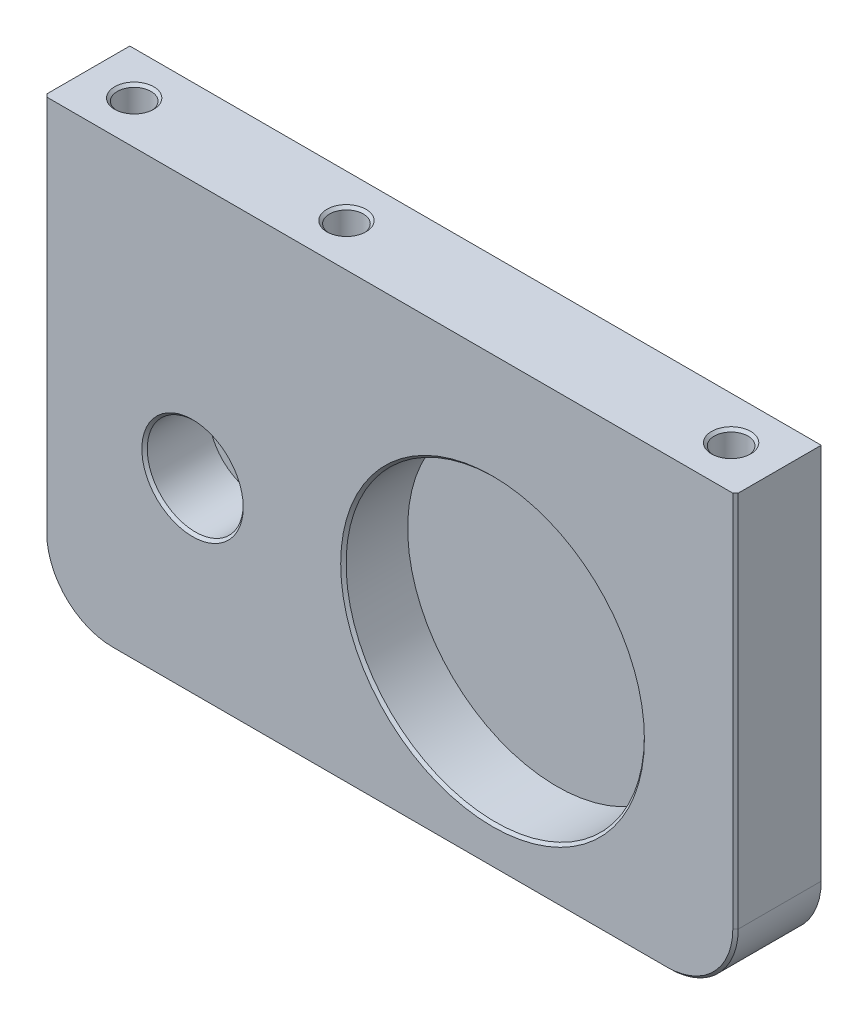
ISO-10303-21;
HEADER;
FILE_DESCRIPTION(('STEP AP214'),'2;1');
FILE_NAME('part.step','',(''),(''),'','','');
FILE_SCHEMA(('AUTOMOTIVE_DESIGN { 1 0 10303 214 1 1 1 1 }'));
ENDSEC;
DATA;
#1=APPLICATION_CONTEXT('core data for automotive mechanical design processes');
#2=APPLICATION_PROTOCOL_DEFINITION('international standard','automotive_design',2000,#1);
#3=PRODUCT_CONTEXT('',#1,'mechanical');
#4=PRODUCT('Part','Part','',(#3));
#5=PRODUCT_RELATED_PRODUCT_CATEGORY('part','',(#4));
#6=PRODUCT_DEFINITION_FORMATION('','',#4);
#7=PRODUCT_DEFINITION_CONTEXT('part definition',#1,'design');
#8=PRODUCT_DEFINITION('design','',#6,#7);
#9=PRODUCT_DEFINITION_SHAPE('','',#8);
#10=(LENGTH_UNIT() NAMED_UNIT(*) SI_UNIT(.MILLI.,.METRE.));
#11=(NAMED_UNIT(*) PLANE_ANGLE_UNIT() SI_UNIT($,.RADIAN.));
#12=(NAMED_UNIT(*) SI_UNIT($,.STERADIAN.) SOLID_ANGLE_UNIT());
#13=UNCERTAINTY_MEASURE_WITH_UNIT(LENGTH_MEASURE(1.E-05),#10,'distance_accuracy_value','');
#14=(GEOMETRIC_REPRESENTATION_CONTEXT(3) GLOBAL_UNCERTAINTY_ASSIGNED_CONTEXT((#13)) GLOBAL_UNIT_ASSIGNED_CONTEXT((#10,
#11,#12)) REPRESENTATION_CONTEXT('',''));
#15=CARTESIAN_POINT('',(0.,0.,0.));
#16=DIRECTION('',(0.,0.,1.));
#17=DIRECTION('',(1.,0.,0.));
#18=AXIS2_PLACEMENT_3D('',#15,#16,#17);
#19=CARTESIAN_POINT('',(-33.225,19.05,145.761703917476));
#20=DIRECTION('',(-1.,0.,0.));
#21=DIRECTION('',(0.,-1.,0.));
#22=AXIS2_PLACEMENT_3D('',#19,#20,#21);
#23=PLANE('',#22);
#24=DIRECTION('',(0.,0.,1.));
#25=VECTOR('',#24,1.);
#26=CARTESIAN_POINT('',(-33.225,-8.92,145.761703917476));
#27=LINE('',#26,#25);
#28=CARTESIAN_POINT('',(-33.225,-8.92,145.761703917476));
#29=VERTEX_POINT('',#28);
#30=CARTESIAN_POINT('',(-33.225,-8.92,151.911703917476));
#31=VERTEX_POINT('',#30);
#32=EDGE_CURVE('E152',#29,#31,#27,.T.);
#33=ORIENTED_EDGE('',*,*,#32,.T.);
#34=DIRECTION('',(0.,1.,0.));
#35=VECTOR('',#34,1.);
#36=CARTESIAN_POINT('',(-33.225,19.05,151.911703917476));
#37=LINE('',#36,#35);
#38=CARTESIAN_POINT('',(-33.225,19.05,151.911703917476));
#39=VERTEX_POINT('',#38);
#40=EDGE_CURVE('E189',#31,#39,#37,.T.);
#41=ORIENTED_EDGE('',*,*,#40,.T.);
#42=DIRECTION('',(0.,0.,1.));
#43=VECTOR('',#42,1.);
#44=CARTESIAN_POINT('',(-33.225,19.05,145.761703917476));
#45=LINE('',#44,#43);
#46=CARTESIAN_POINT('',(-33.225,19.05,145.761703917476));
#47=VERTEX_POINT('',#46);
#48=EDGE_CURVE('E128',#47,#39,#45,.T.);
#49=ORIENTED_EDGE('',*,*,#48,.F.);
#50=DIRECTION('',(0.,-1.,0.));
#51=VECTOR('',#50,1.);
#52=CARTESIAN_POINT('',(-33.225,19.05,145.761703917476));
#53=LINE('',#52,#51);
#54=EDGE_CURVE('E133',#47,#29,#53,.T.);
#55=ORIENTED_EDGE('',*,*,#54,.T.);
#56=EDGE_LOOP('',(#33,#41,#49,#55));
#57=FACE_BOUND('',#56,.T.);
#58=ADVANCED_FACE('F36',(#57),#23,.T.);
#59=CARTESIAN_POINT('',(-33.225,19.05,145.761703917476));
#60=DIRECTION('',(0.,1.,0.));
#61=DIRECTION('',(0.,0.,1.));
#62=AXIS2_PLACEMENT_3D('',#59,#60,#61);
#63=PLANE('',#62);
#64=CARTESIAN_POINT('',(14.5,19.05,148.936703917476));
#65=DIRECTION('',(0.,1.,0.));
#66=DIRECTION('',(0.,0.,1.));
#67=AXIS2_PLACEMENT_3D('',#64,#65,#66);
#68=CIRCLE('',#67,1.45000000000001);
#69=CARTESIAN_POINT('',(14.5,19.05,150.386703917476));
#70=VERTEX_POINT('',#69);
#71=EDGE_CURVE('E179',#70,#70,#68,.F.);
#72=ORIENTED_EDGE('',*,*,#71,.T.);
#73=EDGE_LOOP('',(#72));
#74=FACE_BOUND('',#73,.T.);
#75=CARTESIAN_POINT('',(-29.725,19.05,148.936703917476));
#76=DIRECTION('',(0.,1.,0.));
#77=DIRECTION('',(0.,0.,1.));
#78=AXIS2_PLACEMENT_3D('',#75,#76,#77);
#79=CIRCLE('',#78,1.45000000000001);
#80=CARTESIAN_POINT('',(-29.725,19.05,150.386703917476));
#81=VERTEX_POINT('',#80);
#82=EDGE_CURVE('E176',#81,#81,#79,.F.);
#83=ORIENTED_EDGE('',*,*,#82,.T.);
#84=EDGE_LOOP('',(#83));
#85=FACE_BOUND('',#84,.T.);
#86=CARTESIAN_POINT('',(-14.,19.05,148.936703917476));
#87=DIRECTION('',(0.,1.,0.));
#88=DIRECTION('',(0.,0.,1.));
#89=AXIS2_PLACEMENT_3D('',#86,#87,#88);
#90=CIRCLE('',#89,1.45000000000001);
#91=CARTESIAN_POINT('',(-14.,19.05,150.386703917476));
#92=VERTEX_POINT('',#91);
#93=EDGE_CURVE('E173',#92,#92,#90,.F.);
#94=ORIENTED_EDGE('',*,*,#93,.T.);
#95=EDGE_LOOP('',(#94));
#96=FACE_BOUND('',#95,.T.);
#97=DIRECTION('',(-1.,0.,0.));
#98=VECTOR('',#97,1.);
#99=CARTESIAN_POINT('',(-33.225,19.05,152.111703917476));
#100=LINE('',#99,#98);
#101=CARTESIAN_POINT('',(17.8,19.05,152.111703917476));
#102=VERTEX_POINT('',#101);
#103=CARTESIAN_POINT('',(-33.025,19.05,152.111703917476));
#104=VERTEX_POINT('',#103);
#105=EDGE_CURVE('E137',#102,#104,#100,.T.);
#106=ORIENTED_EDGE('',*,*,#105,.F.);
#107=DIRECTION('',(-0.707106781186561,0.,0.707106781186534));
#108=VECTOR('',#107,1.);
#109=CARTESIAN_POINT('',(-4.53750000000096,19.05,174.449203917476));
#110=LINE('',#109,#108);
#111=CARTESIAN_POINT('',(18.,19.05,151.911703917476));
#112=VERTEX_POINT('',#111);
#113=EDGE_CURVE('E127',#102,#112,#110,.F.);
#114=ORIENTED_EDGE('',*,*,#113,.T.);
#115=DIRECTION('',(0.,0.,1.));
#116=VECTOR('',#115,1.);
#117=CARTESIAN_POINT('',(18.,19.05,145.761703917476));
#118=LINE('',#117,#116);
#119=CARTESIAN_POINT('',(18.,19.05,145.761703917476));
#120=VERTEX_POINT('',#119);
#121=EDGE_CURVE('E113',#120,#112,#118,.T.);
#122=ORIENTED_EDGE('',*,*,#121,.F.);
#123=DIRECTION('',(-1.,0.,0.));
#124=VECTOR('',#123,1.);
#125=CARTESIAN_POINT('',(-33.225,19.05,145.761703917476));
#126=LINE('',#125,#124);
#127=EDGE_CURVE('E118',#120,#47,#126,.T.);
#128=ORIENTED_EDGE('',*,*,#127,.T.);
#129=ORIENTED_EDGE('',*,*,#48,.T.);
#130=DIRECTION('',(-0.707106781186565,0.,-0.70710678118653));
#131=VECTOR('',#130,1.);
#132=CARTESIAN_POINT('',(-36.3,19.05,148.836703917476));
#133=LINE('',#132,#131);
#134=EDGE_CURVE('E182',#39,#104,#133,.F.);
#135=ORIENTED_EDGE('',*,*,#134,.T.);
#136=EDGE_LOOP('',(#106,#114,#122,#128,#129,#135));
#137=FACE_BOUND('',#136,.T.);
#138=ADVANCED_FACE('F124',(#74,#85,#96,#137),#63,.T.);
#139=CARTESIAN_POINT('',(18.,19.05,145.761703917476));
#140=DIRECTION('',(1.,0.,0.));
#141=DIRECTION('',(0.,1.,0.));
#142=AXIS2_PLACEMENT_3D('',#139,#140,#141);
#143=PLANE('',#142);
#144=ORIENTED_EDGE('',*,*,#121,.T.);
#145=DIRECTION('',(0.,-1.,0.));
#146=VECTOR('',#145,1.);
#147=CARTESIAN_POINT('',(18.,19.05,151.911703917476));
#148=LINE('',#147,#146);
#149=CARTESIAN_POINT('',(18.,-8.92,151.911703917476));
#150=VERTEX_POINT('',#149);
#151=EDGE_CURVE('E61',#112,#150,#148,.T.);
#152=ORIENTED_EDGE('',*,*,#151,.T.);
#153=DIRECTION('',(0.,0.,1.));
#154=VECTOR('',#153,1.);
#155=CARTESIAN_POINT('',(18.,-8.92,145.761703917476));
#156=LINE('',#155,#154);
#157=CARTESIAN_POINT('',(18.,-8.92,145.761703917476));
#158=VERTEX_POINT('',#157);
#159=EDGE_CURVE('E114',#150,#158,#156,.F.);
#160=ORIENTED_EDGE('',*,*,#159,.T.);
#161=DIRECTION('',(0.,1.,0.));
#162=VECTOR('',#161,1.);
#163=CARTESIAN_POINT('',(18.,19.05,145.761703917476));
#164=LINE('',#163,#162);
#165=EDGE_CURVE('E110',#158,#120,#164,.T.);
#166=ORIENTED_EDGE('',*,*,#165,.T.);
#167=EDGE_LOOP('',(#144,#152,#160,#166));
#168=FACE_BOUND('',#167,.T.);
#169=ADVANCED_FACE('F112',(#168),#143,.T.);
#170=CARTESIAN_POINT('',(-33.225,-14.,145.761703917476));
#171=DIRECTION('',(0.,-1.,0.));
#172=DIRECTION('',(0.,0.,-1.));
#173=AXIS2_PLACEMENT_3D('',#170,#171,#172);
#174=PLANE('',#173);
#175=DIRECTION('',(0.,0.,1.));
#176=VECTOR('',#175,1.);
#177=CARTESIAN_POINT('',(12.92,-14.,145.761703917476));
#178=LINE('',#177,#176);
#179=CARTESIAN_POINT('',(12.92,-14.,145.761703917476));
#180=VERTEX_POINT('',#179);
#181=CARTESIAN_POINT('',(12.92,-14.,151.911703917476));
#182=VERTEX_POINT('',#181);
#183=EDGE_CURVE('E144',#180,#182,#178,.T.);
#184=ORIENTED_EDGE('',*,*,#183,.T.);
#185=DIRECTION('',(-1.,0.,0.));
#186=VECTOR('',#185,1.);
#187=CARTESIAN_POINT('',(-33.225,-14.,151.911703917476));
#188=LINE('',#187,#186);
#189=CARTESIAN_POINT('',(-28.145,-14.,151.911703917476));
#190=VERTEX_POINT('',#189);
#191=EDGE_CURVE('E171',#182,#190,#188,.T.);
#192=ORIENTED_EDGE('',*,*,#191,.T.);
#193=DIRECTION('',(0.,0.,1.));
#194=VECTOR('',#193,1.);
#195=CARTESIAN_POINT('',(-28.145,-14.,145.761703917476));
#196=LINE('',#195,#194);
#197=CARTESIAN_POINT('',(-28.145,-14.,145.761703917476));
#198=VERTEX_POINT('',#197);
#199=EDGE_CURVE('E141',#190,#198,#196,.F.);
#200=ORIENTED_EDGE('',*,*,#199,.T.);
#201=DIRECTION('',(1.,0.,0.));
#202=VECTOR('',#201,1.);
#203=CARTESIAN_POINT('',(-33.225,-14.,145.761703917476));
#204=LINE('',#203,#202);
#205=EDGE_CURVE('E119',#198,#180,#204,.T.);
#206=ORIENTED_EDGE('',*,*,#205,.T.);
#207=EDGE_LOOP('',(#184,#192,#200,#206));
#208=FACE_BOUND('',#207,.T.);
#209=ADVANCED_FACE('F236',(#208),#174,.T.);
#210=CARTESIAN_POINT('',(0.,0.,145.761703917476));
#211=DIRECTION('',(0.,0.,1.));
#212=DIRECTION('',(1.,0.,0.));
#213=AXIS2_PLACEMENT_3D('',#210,#211,#212);
#214=PLANE('',#213);
#215=ORIENTED_EDGE('',*,*,#165,.F.);
#216=CARTESIAN_POINT('',(12.92,-8.92,145.761703917476));
#217=DIRECTION('',(0.,0.,1.));
#218=DIRECTION('',(1.,0.,0.));
#219=AXIS2_PLACEMENT_3D('',#216,#217,#218);
#220=CIRCLE('',#219,5.08);
#221=EDGE_CURVE('E150',#158,#180,#220,.F.);
#222=ORIENTED_EDGE('',*,*,#221,.T.);
#223=ORIENTED_EDGE('',*,*,#205,.F.);
#224=CARTESIAN_POINT('',(-28.145,-8.92,145.761703917476));
#225=DIRECTION('',(0.,0.,1.));
#226=DIRECTION('',(1.,0.,0.));
#227=AXIS2_PLACEMENT_3D('',#224,#225,#226);
#228=CIRCLE('',#227,5.08);
#229=EDGE_CURVE('E148',#198,#29,#228,.F.);
#230=ORIENTED_EDGE('',*,*,#229,.T.);
#231=ORIENTED_EDGE('',*,*,#54,.F.);
#232=ORIENTED_EDGE('',*,*,#127,.F.);
#233=EDGE_LOOP('',(#215,#222,#223,#230,#231,#232));
#234=FACE_BOUND('',#233,.T.);
#235=ADVANCED_FACE('F131',(#234),#214,.F.);
#236=CARTESIAN_POINT('',(0.,0.,152.111703917476));
#237=DIRECTION('',(0.,0.,1.));
#238=DIRECTION('',(1.,0.,0.));
#239=AXIS2_PLACEMENT_3D('',#236,#237,#238);
#240=PLANE('',#239);
#241=CARTESIAN_POINT('',(0.,0.,152.111703917476));
#242=DIRECTION('',(0.,0.,1.));
#243=DIRECTION('',(1.,0.,0.));
#244=AXIS2_PLACEMENT_3D('',#241,#242,#243);
#245=CIRCLE('',#244,11.25);
#246=CARTESIAN_POINT('',(11.25,0.,152.111703917476));
#247=VERTEX_POINT('',#246);
#248=EDGE_CURVE('E157',#247,#247,#245,.F.);
#249=ORIENTED_EDGE('',*,*,#248,.T.);
#250=EDGE_LOOP('',(#249));
#251=FACE_BOUND('',#250,.T.);
#252=CARTESIAN_POINT('',(-22.225,0.,152.111703917476));
#253=DIRECTION('',(0.,0.,1.));
#254=DIRECTION('',(1.,0.,0.));
#255=AXIS2_PLACEMENT_3D('',#252,#253,#254);
#256=CIRCLE('',#255,3.75600000000004);
#257=CARTESIAN_POINT('',(-18.469,0.,152.111703917476));
#258=VERTEX_POINT('',#257);
#259=EDGE_CURVE('E154',#258,#258,#256,.F.);
#260=ORIENTED_EDGE('',*,*,#259,.T.);
#261=EDGE_LOOP('',(#260));
#262=FACE_BOUND('',#261,.T.);
#263=CARTESIAN_POINT('',(12.92,-8.92,152.111703917476));
#264=DIRECTION('',(0.,0.,1.));
#265=DIRECTION('',(1.,0.,0.));
#266=AXIS2_PLACEMENT_3D('',#263,#264,#265);
#267=CIRCLE('',#266,4.87999999999998);
#268=CARTESIAN_POINT('',(12.92,-13.8,152.111703917476));
#269=VERTEX_POINT('',#268);
#270=CARTESIAN_POINT('',(17.8,-8.92,152.111703917476));
#271=VERTEX_POINT('',#270);
#272=EDGE_CURVE('E167',#269,#271,#267,.T.);
#273=ORIENTED_EDGE('',*,*,#272,.T.);
#274=DIRECTION('',(0.,1.,0.));
#275=VECTOR('',#274,1.);
#276=CARTESIAN_POINT('',(17.8,0.,152.111703917476));
#277=LINE('',#276,#275);
#278=EDGE_CURVE('E169',#271,#102,#277,.T.);
#279=ORIENTED_EDGE('',*,*,#278,.T.);
#280=ORIENTED_EDGE('',*,*,#105,.T.);
#281=DIRECTION('',(0.,-1.,0.));
#282=VECTOR('',#281,1.);
#283=CARTESIAN_POINT('',(-33.025,0.,152.111703917476));
#284=LINE('',#283,#282);
#285=CARTESIAN_POINT('',(-33.025,-8.92,152.111703917476));
#286=VERTEX_POINT('',#285);
#287=EDGE_CURVE('E160',#104,#286,#284,.T.);
#288=ORIENTED_EDGE('',*,*,#287,.T.);
#289=CARTESIAN_POINT('',(-28.145,-8.92,152.111703917476));
#290=DIRECTION('',(0.,0.,1.));
#291=DIRECTION('',(1.,0.,0.));
#292=AXIS2_PLACEMENT_3D('',#289,#290,#291);
#293=CIRCLE('',#292,4.87999999999999);
#294=CARTESIAN_POINT('',(-28.145,-13.8,152.111703917476));
#295=VERTEX_POINT('',#294);
#296=EDGE_CURVE('E162',#286,#295,#293,.T.);
#297=ORIENTED_EDGE('',*,*,#296,.T.);
#298=DIRECTION('',(1.,0.,0.));
#299=VECTOR('',#298,1.);
#300=CARTESIAN_POINT('',(0.,-13.8,152.111703917476));
#301=LINE('',#300,#299);
#302=EDGE_CURVE('E164',#295,#269,#301,.T.);
#303=ORIENTED_EDGE('',*,*,#302,.T.);
#304=EDGE_LOOP('',(#273,#279,#280,#288,#297,#303));
#305=FACE_BOUND('',#304,.T.);
#306=ADVANCED_FACE('F250',(#251,#262,#305),#240,.T.);
#307=CARTESIAN_POINT('',(-22.225,0.,114.507584189031));
#308=DIRECTION('',(0.,0.,1.));
#309=DIRECTION('',(1.,0.,0.));
#310=AXIS2_PLACEMENT_3D('',#307,#308,#309);
#311=CYLINDRICAL_SURFACE('',#310,3.556);
#312=CARTESIAN_POINT('',(-22.225,0.,151.911703917476));
#313=DIRECTION('',(0.,0.,1.));
#314=DIRECTION('',(1.,0.,0.));
#315=AXIS2_PLACEMENT_3D('',#312,#313,#314);
#316=CIRCLE('',#315,3.556);
#317=CARTESIAN_POINT('',(-18.669,0.,151.911703917476));
#318=VERTEX_POINT('',#317);
#319=EDGE_CURVE('E12',#318,#318,#316,.T.);
#320=ORIENTED_EDGE('',*,*,#319,.T.);
#321=EDGE_LOOP('',(#320));
#322=FACE_BOUND('',#321,.T.);
#323=CARTESIAN_POINT('',(-22.225,0.,147.349203917476));
#324=DIRECTION('',(0.,0.,1.));
#325=DIRECTION('',(1.,0.,0.));
#326=AXIS2_PLACEMENT_3D('',#323,#324,#325);
#327=CIRCLE('',#326,3.556);
#328=CARTESIAN_POINT('',(-18.669,0.,147.349203917476));
#329=VERTEX_POINT('',#328);
#330=EDGE_CURVE('E229',#329,#329,#327,.F.);
#331=ORIENTED_EDGE('',*,*,#330,.T.);
#332=EDGE_LOOP('',(#331));
#333=FACE_BOUND('',#332,.T.);
#334=ADVANCED_FACE('F449',(#322,#333),#311,.F.);
#335=CARTESIAN_POINT('',(0.,0.,147.349203917476));
#336=DIRECTION('',(0.,0.,1.));
#337=DIRECTION('',(1.,0.,0.));
#338=AXIS2_PLACEMENT_3D('',#335,#336,#337);
#339=PLANE('',#338);
#340=ORIENTED_EDGE('',*,*,#330,.F.);
#341=EDGE_LOOP('',(#340));
#342=FACE_BOUND('',#341,.T.);
#343=ADVANCED_FACE('F440',(#342),#339,.T.);
#344=CARTESIAN_POINT('',(0.,0.,114.507584189031));
#345=DIRECTION('',(0.,0.,1.));
#346=DIRECTION('',(1.,0.,0.));
#347=AXIS2_PLACEMENT_3D('',#344,#345,#346);
#348=CYLINDRICAL_SURFACE('',#347,11.05);
#349=CARTESIAN_POINT('',(0.,0.,151.911703917476));
#350=DIRECTION('',(0.,0.,1.));
#351=DIRECTION('',(1.,0.,0.));
#352=AXIS2_PLACEMENT_3D('',#349,#350,#351);
#353=CIRCLE('',#352,11.05);
#354=CARTESIAN_POINT('',(11.05,0.,151.911703917476));
#355=VERTEX_POINT('',#354);
#356=EDGE_CURVE('E45',#355,#355,#353,.T.);
#357=ORIENTED_EDGE('',*,*,#356,.T.);
#358=EDGE_LOOP('',(#357));
#359=FACE_BOUND('',#358,.T.);
#360=CARTESIAN_POINT('',(0.,0.,147.349203917476));
#361=DIRECTION('',(0.,0.,1.));
#362=DIRECTION('',(1.,0.,0.));
#363=AXIS2_PLACEMENT_3D('',#360,#361,#362);
#364=CIRCLE('',#363,11.05);
#365=CARTESIAN_POINT('',(11.05,0.,147.349203917476));
#366=VERTEX_POINT('',#365);
#367=EDGE_CURVE('E140',#366,#366,#364,.F.);
#368=ORIENTED_EDGE('',*,*,#367,.T.);
#369=EDGE_LOOP('',(#368));
#370=FACE_BOUND('',#369,.T.);
#371=ADVANCED_FACE('F431',(#359,#370),#348,.F.);
#372=CARTESIAN_POINT('',(0.,0.,147.349203917476));
#373=DIRECTION('',(0.,0.,1.));
#374=DIRECTION('',(1.,0.,0.));
#375=AXIS2_PLACEMENT_3D('',#372,#373,#374);
#376=PLANE('',#375);
#377=ORIENTED_EDGE('',*,*,#367,.F.);
#378=EDGE_LOOP('',(#377));
#379=FACE_BOUND('',#378,.T.);
#380=ADVANCED_FACE('F422',(#379),#376,.T.);
#381=CARTESIAN_POINT('',(14.5,4.05,148.936703917476));
#382=DIRECTION('',(0.,1.,0.));
#383=DIRECTION('',(0.,0.,1.));
#384=AXIS2_PLACEMENT_3D('',#381,#382,#383);
#385=CYLINDRICAL_SURFACE('',#384,1.25);
#386=CARTESIAN_POINT('',(14.5,18.85,148.936703917476));
#387=DIRECTION('',(0.,1.,0.));
#388=DIRECTION('',(0.,0.,1.));
#389=AXIS2_PLACEMENT_3D('',#386,#387,#388);
#390=CIRCLE('',#389,1.25);
#391=CARTESIAN_POINT('',(14.5,18.85,150.186703917476));
#392=VERTEX_POINT('',#391);
#393=EDGE_CURVE('E191',#392,#392,#390,.T.);
#394=ORIENTED_EDGE('',*,*,#393,.T.);
#395=EDGE_LOOP('',(#394));
#396=FACE_BOUND('',#395,.T.);
#397=CARTESIAN_POINT('',(14.5,4.05,148.936703917476));
#398=DIRECTION('',(0.,1.,0.));
#399=DIRECTION('',(0.,0.,1.));
#400=AXIS2_PLACEMENT_3D('',#397,#398,#399);
#401=CIRCLE('',#400,1.25);
#402=CARTESIAN_POINT('',(14.5,4.05,150.186703917476));
#403=VERTEX_POINT('',#402);
#404=EDGE_CURVE('E213',#403,#403,#401,.T.);
#405=ORIENTED_EDGE('',*,*,#404,.F.);
#406=EDGE_LOOP('',(#405));
#407=FACE_BOUND('',#406,.T.);
#408=ADVANCED_FACE('F414',(#396,#407),#385,.F.);
#409=CARTESIAN_POINT('',(14.5,4.05,148.936703917476));
#410=DIRECTION('',(0.,1.,0.));
#411=DIRECTION('',(0.,0.,1.));
#412=AXIS2_PLACEMENT_3D('',#409,#410,#411);
#413=PLANE('',#412);
#414=ORIENTED_EDGE('',*,*,#404,.T.);
#415=EDGE_LOOP('',(#414));
#416=FACE_BOUND('',#415,.T.);
#417=ADVANCED_FACE('F405',(#416),#413,.T.);
#418=CARTESIAN_POINT('',(-14.,4.05,148.936703917476));
#419=DIRECTION('',(0.,1.,0.));
#420=DIRECTION('',(0.,0.,1.));
#421=AXIS2_PLACEMENT_3D('',#418,#419,#420);
#422=CYLINDRICAL_SURFACE('',#421,1.25);
#423=CARTESIAN_POINT('',(-14.,18.85,148.936703917476));
#424=DIRECTION('',(0.,1.,0.));
#425=DIRECTION('',(0.,0.,1.));
#426=AXIS2_PLACEMENT_3D('',#423,#424,#425);
#427=CIRCLE('',#426,1.25);
#428=CARTESIAN_POINT('',(-14.,18.85,150.186703917476));
#429=VERTEX_POINT('',#428);
#430=EDGE_CURVE('E197',#429,#429,#427,.T.);
#431=ORIENTED_EDGE('',*,*,#430,.T.);
#432=EDGE_LOOP('',(#431));
#433=FACE_BOUND('',#432,.T.);
#434=CARTESIAN_POINT('',(-14.,4.05,148.936703917476));
#435=DIRECTION('',(0.,1.,0.));
#436=DIRECTION('',(0.,0.,1.));
#437=AXIS2_PLACEMENT_3D('',#434,#435,#436);
#438=CIRCLE('',#437,1.25);
#439=CARTESIAN_POINT('',(-14.,4.05,150.186703917476));
#440=VERTEX_POINT('',#439);
#441=EDGE_CURVE('E218',#440,#440,#438,.T.);
#442=ORIENTED_EDGE('',*,*,#441,.F.);
#443=EDGE_LOOP('',(#442));
#444=FACE_BOUND('',#443,.T.);
#445=ADVANCED_FACE('F396',(#433,#444),#422,.F.);
#446=CARTESIAN_POINT('',(-14.,4.05,148.936703917476));
#447=DIRECTION('',(0.,1.,0.));
#448=DIRECTION('',(0.,0.,1.));
#449=AXIS2_PLACEMENT_3D('',#446,#447,#448);
#450=PLANE('',#449);
#451=ORIENTED_EDGE('',*,*,#441,.T.);
#452=EDGE_LOOP('',(#451));
#453=FACE_BOUND('',#452,.T.);
#454=ADVANCED_FACE('F387',(#453),#450,.T.);
#455=CARTESIAN_POINT('',(-29.725,4.05,148.936703917476));
#456=DIRECTION('',(0.,1.,0.));
#457=DIRECTION('',(0.,0.,1.));
#458=AXIS2_PLACEMENT_3D('',#455,#456,#457);
#459=CYLINDRICAL_SURFACE('',#458,1.25);
#460=CARTESIAN_POINT('',(-29.725,18.85,148.936703917476));
#461=DIRECTION('',(0.,1.,0.));
#462=DIRECTION('',(0.,0.,1.));
#463=AXIS2_PLACEMENT_3D('',#460,#461,#462);
#464=CIRCLE('',#463,1.25);
#465=CARTESIAN_POINT('',(-29.725,18.85,150.186703917476));
#466=VERTEX_POINT('',#465);
#467=EDGE_CURVE('E194',#466,#466,#464,.T.);
#468=ORIENTED_EDGE('',*,*,#467,.T.);
#469=EDGE_LOOP('',(#468));
#470=FACE_BOUND('',#469,.T.);
#471=CARTESIAN_POINT('',(-29.725,4.05,148.936703917476));
#472=DIRECTION('',(0.,1.,0.));
#473=DIRECTION('',(0.,0.,1.));
#474=AXIS2_PLACEMENT_3D('',#471,#472,#473);
#475=CIRCLE('',#474,1.25);
#476=CARTESIAN_POINT('',(-29.725,4.05,150.186703917476));
#477=VERTEX_POINT('',#476);
#478=EDGE_CURVE('E223',#477,#477,#475,.T.);
#479=ORIENTED_EDGE('',*,*,#478,.F.);
#480=EDGE_LOOP('',(#479));
#481=FACE_BOUND('',#480,.T.);
#482=ADVANCED_FACE('F377',(#470,#481),#459,.F.);
#483=CARTESIAN_POINT('',(-29.725,4.05,148.936703917476));
#484=DIRECTION('',(0.,1.,0.));
#485=DIRECTION('',(0.,0.,1.));
#486=AXIS2_PLACEMENT_3D('',#483,#484,#485);
#487=PLANE('',#486);
#488=ORIENTED_EDGE('',*,*,#478,.T.);
#489=EDGE_LOOP('',(#488));
#490=FACE_BOUND('',#489,.T.);
#491=ADVANCED_FACE('F280',(#490),#487,.T.);
#492=CARTESIAN_POINT('',(12.92,-8.92,145.761703917476));
#493=DIRECTION('',(0.,0.,1.));
#494=DIRECTION('',(1.,0.,0.));
#495=AXIS2_PLACEMENT_3D('',#492,#493,#494);
#496=CYLINDRICAL_SURFACE('',#495,5.08);
#497=ORIENTED_EDGE('',*,*,#159,.F.);
#498=CARTESIAN_POINT('',(12.92,-8.92,151.911703917476));
#499=DIRECTION('',(0.,0.,1.));
#500=DIRECTION('',(1.,0.,0.));
#501=AXIS2_PLACEMENT_3D('',#498,#499,#500);
#502=CIRCLE('',#501,5.08);
#503=EDGE_CURVE('E186',#150,#182,#502,.F.);
#504=ORIENTED_EDGE('',*,*,#503,.T.);
#505=ORIENTED_EDGE('',*,*,#183,.F.);
#506=ORIENTED_EDGE('',*,*,#221,.F.);
#507=EDGE_LOOP('',(#497,#504,#505,#506));
#508=FACE_BOUND('',#507,.T.);
#509=ADVANCED_FACE('F240',(#508),#496,.T.);
#510=CARTESIAN_POINT('',(-28.145,-8.92,145.761703917476));
#511=DIRECTION('',(0.,0.,1.));
#512=DIRECTION('',(1.,0.,0.));
#513=AXIS2_PLACEMENT_3D('',#510,#511,#512);
#514=CYLINDRICAL_SURFACE('',#513,5.08);
#515=ORIENTED_EDGE('',*,*,#199,.F.);
#516=CARTESIAN_POINT('',(-28.145,-8.92,151.911703917476));
#517=DIRECTION('',(0.,0.,1.));
#518=DIRECTION('',(1.,0.,0.));
#519=AXIS2_PLACEMENT_3D('',#516,#517,#518);
#520=CIRCLE('',#519,5.08);
#521=EDGE_CURVE('E53',#190,#31,#520,.F.);
#522=ORIENTED_EDGE('',*,*,#521,.T.);
#523=ORIENTED_EDGE('',*,*,#32,.F.);
#524=ORIENTED_EDGE('',*,*,#229,.F.);
#525=EDGE_LOOP('',(#515,#522,#523,#524));
#526=FACE_BOUND('',#525,.T.);
#527=ADVANCED_FACE('F247',(#526),#514,.T.);
#528=CARTESIAN_POINT('',(-33.025,0.,152.111703917476));
#529=DIRECTION('',(0.70710678118653,0.,-0.707106781186565));
#530=DIRECTION('',(0.,-1.,0.));
#531=AXIS2_PLACEMENT_3D('',#528,#529,#530);
#532=PLANE('',#531);
#533=ORIENTED_EDGE('',*,*,#134,.F.);
#534=ORIENTED_EDGE('',*,*,#40,.F.);
#535=DIRECTION('',(-0.70710678118656,0.,-0.707106781186535));
#536=VECTOR('',#535,1.);
#537=CARTESIAN_POINT('',(-33.025,-8.92,152.111703917476));
#538=LINE('',#537,#536);
#539=EDGE_CURVE('E40',#286,#31,#538,.T.);
#540=ORIENTED_EDGE('',*,*,#539,.F.);
#541=ORIENTED_EDGE('',*,*,#287,.F.);
#542=EDGE_LOOP('',(#533,#534,#540,#541));
#543=FACE_BOUND('',#542,.T.);
#544=ADVANCED_FACE('F255',(#543),#532,.F.);
#545=CARTESIAN_POINT('',(17.8,0.,152.111703917476));
#546=DIRECTION('',(-0.707106781186534,0.,-0.707106781186561));
#547=DIRECTION('',(0.,1.,0.));
#548=AXIS2_PLACEMENT_3D('',#545,#546,#547);
#549=PLANE('',#548);
#550=ORIENTED_EDGE('',*,*,#113,.F.);
#551=ORIENTED_EDGE('',*,*,#278,.F.);
#552=DIRECTION('',(-0.70710678118656,0.,0.707106781186535));
#553=VECTOR('',#552,1.);
#554=CARTESIAN_POINT('',(18.,-8.92,151.911703917476));
#555=LINE('',#554,#553);
#556=EDGE_CURVE('E206',#150,#271,#555,.T.);
#557=ORIENTED_EDGE('',*,*,#556,.F.);
#558=ORIENTED_EDGE('',*,*,#151,.F.);
#559=EDGE_LOOP('',(#550,#551,#557,#558));
#560=FACE_BOUND('',#559,.T.);
#561=ADVANCED_FACE('F259',(#560),#549,.F.);
#562=CARTESIAN_POINT('',(-28.145,-8.92,152.111703917476));
#563=DIRECTION('',(0.,0.,-1.));
#564=DIRECTION('',(-1.,0.,0.));
#565=AXIS2_PLACEMENT_3D('',#562,#563,#564);
#566=CONICAL_SURFACE('',#565,4.87999999999999,0.785398163397463);
#567=ORIENTED_EDGE('',*,*,#539,.T.);
#568=ORIENTED_EDGE('',*,*,#521,.F.);
#569=DIRECTION('',(0.,-0.707106781186557,-0.707106781186538));
#570=VECTOR('',#569,1.);
#571=CARTESIAN_POINT('',(-28.145,-13.8,152.111703917476));
#572=LINE('',#571,#570);
#573=EDGE_CURVE('E204',#295,#190,#572,.T.);
#574=ORIENTED_EDGE('',*,*,#573,.F.);
#575=ORIENTED_EDGE('',*,*,#296,.F.);
#576=EDGE_LOOP('',(#567,#568,#574,#575));
#577=FACE_BOUND('',#576,.T.);
#578=ADVANCED_FACE('F248',(#577),#566,.T.);
#579=CARTESIAN_POINT('',(12.92,-8.92,152.111703917476));
#580=DIRECTION('',(0.,0.,-1.));
#581=DIRECTION('',(-1.,0.,0.));
#582=AXIS2_PLACEMENT_3D('',#579,#580,#581);
#583=CONICAL_SURFACE('',#582,4.87999999999999,0.785398163397468);
#584=ORIENTED_EDGE('',*,*,#556,.T.);
#585=ORIENTED_EDGE('',*,*,#272,.F.);
#586=DIRECTION('',(0.,0.707106781186563,0.707106781186532));
#587=VECTOR('',#586,1.);
#588=CARTESIAN_POINT('',(12.92,-14.,151.911703917476));
#589=LINE('',#588,#587);
#590=EDGE_CURVE('E202',#182,#269,#589,.T.);
#591=ORIENTED_EDGE('',*,*,#590,.F.);
#592=ORIENTED_EDGE('',*,*,#503,.F.);
#593=EDGE_LOOP('',(#584,#585,#591,#592));
#594=FACE_BOUND('',#593,.T.);
#595=ADVANCED_FACE('F242',(#594),#583,.T.);
#596=CARTESIAN_POINT('',(0.,-13.8,152.111703917476));
#597=DIRECTION('',(0.,0.707106781186535,-0.70710678118656));
#598=DIRECTION('',(1.,0.,0.));
#599=AXIS2_PLACEMENT_3D('',#596,#597,#598);
#600=PLANE('',#599);
#601=ORIENTED_EDGE('',*,*,#573,.T.);
#602=ORIENTED_EDGE('',*,*,#191,.F.);
#603=ORIENTED_EDGE('',*,*,#590,.T.);
#604=ORIENTED_EDGE('',*,*,#302,.F.);
#605=EDGE_LOOP('',(#601,#602,#603,#604));
#606=FACE_BOUND('',#605,.T.);
#607=ADVANCED_FACE('F245',(#606),#600,.F.);
#608=CARTESIAN_POINT('',(14.5,18.85,148.936703917476));
#609=DIRECTION('',(0.,1.,0.));
#610=DIRECTION('',(0.,0.,1.));
#611=AXIS2_PLACEMENT_3D('',#608,#609,#610);
#612=CONICAL_SURFACE('',#611,1.25,0.785398163397456);
#613=ORIENTED_EDGE('',*,*,#71,.F.);
#614=EDGE_LOOP('',(#613));
#615=FACE_BOUND('',#614,.T.);
#616=ORIENTED_EDGE('',*,*,#393,.F.);
#617=EDGE_LOOP('',(#616));
#618=FACE_BOUND('',#617,.T.);
#619=ADVANCED_FACE('F285',(#615,#618),#612,.F.);
#620=CARTESIAN_POINT('',(-29.725,18.85,148.936703917476));
#621=DIRECTION('',(0.,1.,0.));
#622=DIRECTION('',(0.,0.,1.));
#623=AXIS2_PLACEMENT_3D('',#620,#621,#622);
#624=CONICAL_SURFACE('',#623,1.25,0.785398163397456);
#625=ORIENTED_EDGE('',*,*,#82,.F.);
#626=EDGE_LOOP('',(#625));
#627=FACE_BOUND('',#626,.T.);
#628=ORIENTED_EDGE('',*,*,#467,.F.);
#629=EDGE_LOOP('',(#628));
#630=FACE_BOUND('',#629,.T.);
#631=ADVANCED_FACE('F301',(#627,#630),#624,.F.);
#632=CARTESIAN_POINT('',(-14.,18.85,148.936703917476));
#633=DIRECTION('',(0.,1.,0.));
#634=DIRECTION('',(0.,0.,1.));
#635=AXIS2_PLACEMENT_3D('',#632,#633,#634);
#636=CONICAL_SURFACE('',#635,1.25,0.785398163397456);
#637=ORIENTED_EDGE('',*,*,#93,.F.);
#638=EDGE_LOOP('',(#637));
#639=FACE_BOUND('',#638,.T.);
#640=ORIENTED_EDGE('',*,*,#430,.F.);
#641=EDGE_LOOP('',(#640));
#642=FACE_BOUND('',#641,.T.);
#643=ADVANCED_FACE('F309',(#639,#642),#636,.F.);
#644=CARTESIAN_POINT('',(0.,0.,151.911703917476));
#645=DIRECTION('',(0.,0.,1.));
#646=DIRECTION('',(1.,0.,0.));
#647=AXIS2_PLACEMENT_3D('',#644,#645,#646);
#648=CONICAL_SURFACE('',#647,11.05,0.78539816339744);
#649=ORIENTED_EDGE('',*,*,#248,.F.);
#650=EDGE_LOOP('',(#649));
#651=FACE_BOUND('',#650,.T.);
#652=ORIENTED_EDGE('',*,*,#356,.F.);
#653=EDGE_LOOP('',(#652));
#654=FACE_BOUND('',#653,.T.);
#655=ADVANCED_FACE('F317',(#651,#654),#648,.F.);
#656=CARTESIAN_POINT('',(-22.225,0.,151.911703917476));
#657=DIRECTION('',(0.,0.,1.));
#658=DIRECTION('',(1.,0.,0.));
#659=AXIS2_PLACEMENT_3D('',#656,#657,#658);
#660=CONICAL_SURFACE('',#659,3.556,0.785398163397459);
#661=ORIENTED_EDGE('',*,*,#259,.F.);
#662=EDGE_LOOP('',(#661));
#663=FACE_BOUND('',#662,.T.);
#664=ORIENTED_EDGE('',*,*,#319,.F.);
#665=EDGE_LOOP('',(#664));
#666=FACE_BOUND('',#665,.T.);
#667=ADVANCED_FACE('F38',(#663,#666),#660,.F.);
#668=CLOSED_SHELL('',(#58,#138,#169,#209,#235,#306,#334,#343,#371,#380,#408,#417,#445,#454,#482,
#491,#509,#527,#544,#561,#578,#595,#607,#619,#631,#643,#655,#667));
#669=MANIFOLD_SOLID_BREP('B2',#668);
#670=ADVANCED_BREP_SHAPE_REPRESENTATION('',(#18,#669),#14);
#671=SHAPE_DEFINITION_REPRESENTATION(#9,#670);
ENDSEC;
END-ISO-10303-21;
